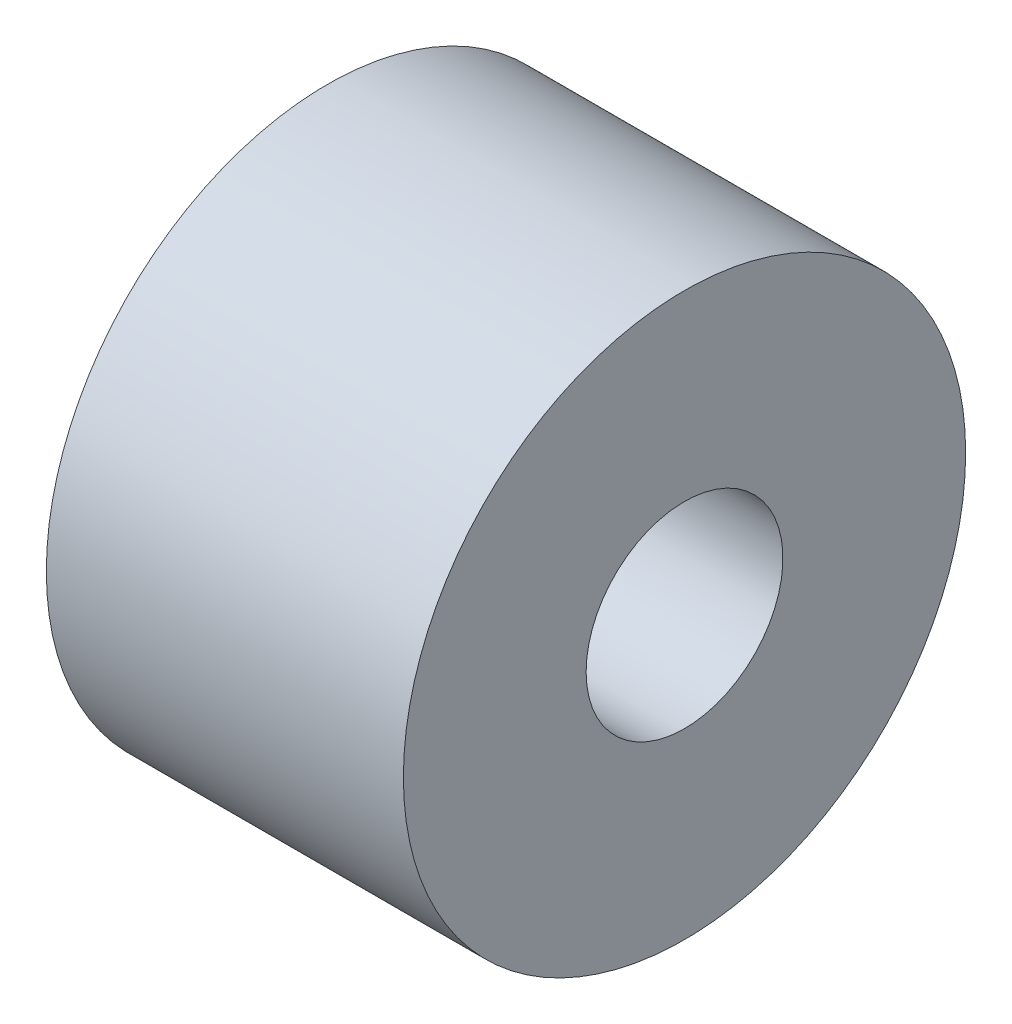
ISO-10303-21;
HEADER;
FILE_DESCRIPTION(('STEP AP214'),'2;1');
FILE_NAME('part.step','',(''),(''),'','','');
FILE_SCHEMA(('AUTOMOTIVE_DESIGN { 1 0 10303 214 1 1 1 1 }'));
ENDSEC;
DATA;
#1=APPLICATION_CONTEXT('core data for automotive mechanical design processes');
#2=APPLICATION_PROTOCOL_DEFINITION('international standard','automotive_design',2000,#1);
#3=PRODUCT_CONTEXT('',#1,'mechanical');
#4=PRODUCT('Part','Part','',(#3));
#5=PRODUCT_RELATED_PRODUCT_CATEGORY('part','',(#4));
#6=PRODUCT_DEFINITION_FORMATION('','',#4);
#7=PRODUCT_DEFINITION_CONTEXT('part definition',#1,'design');
#8=PRODUCT_DEFINITION('design','',#6,#7);
#9=PRODUCT_DEFINITION_SHAPE('','',#8);
#10=(LENGTH_UNIT() NAMED_UNIT(*) SI_UNIT(.MILLI.,.METRE.));
#11=(NAMED_UNIT(*) PLANE_ANGLE_UNIT() SI_UNIT($,.RADIAN.));
#12=(NAMED_UNIT(*) SI_UNIT($,.STERADIAN.) SOLID_ANGLE_UNIT());
#13=UNCERTAINTY_MEASURE_WITH_UNIT(LENGTH_MEASURE(1.E-05),#10,'distance_accuracy_value','');
#14=(GEOMETRIC_REPRESENTATION_CONTEXT(3) GLOBAL_UNCERTAINTY_ASSIGNED_CONTEXT((#13)) GLOBAL_UNIT_ASSIGNED_CONTEXT((#10,
#11,#12)) REPRESENTATION_CONTEXT('',''));
#15=CARTESIAN_POINT('',(0.,0.,0.));
#16=DIRECTION('',(0.,0.,1.));
#17=DIRECTION('',(1.,0.,0.));
#18=AXIS2_PLACEMENT_3D('',#15,#16,#17);
#19=CARTESIAN_POINT('',(12.7,0.,0.));
#20=DIRECTION('',(-1.,0.,0.));
#21=DIRECTION('',(0.,0.,1.));
#22=AXIS2_PLACEMENT_3D('',#19,#20,#21);
#23=CYLINDRICAL_SURFACE('',#22,10.);
#24=CARTESIAN_POINT('',(12.7,0.,0.));
#25=DIRECTION('',(1.,0.,0.));
#26=DIRECTION('',(0.,0.,-1.));
#27=AXIS2_PLACEMENT_3D('',#24,#25,#26);
#28=CIRCLE('',#27,10.);
#29=CARTESIAN_POINT('',(12.7,0.,-10.));
#30=VERTEX_POINT('',#29);
#31=EDGE_CURVE('E10',#30,#30,#28,.T.);
#32=ORIENTED_EDGE('',*,*,#31,.F.);
#33=EDGE_LOOP('',(#32));
#34=FACE_BOUND('',#33,.T.);
#35=CARTESIAN_POINT('',(0.,0.,0.));
#36=DIRECTION('',(1.,0.,0.));
#37=DIRECTION('',(0.,0.,-1.));
#38=AXIS2_PLACEMENT_3D('',#35,#36,#37);
#39=CIRCLE('',#38,10.);
#40=CARTESIAN_POINT('',(0.,0.,-10.));
#41=VERTEX_POINT('',#40);
#42=EDGE_CURVE('E42',#41,#41,#39,.T.);
#43=ORIENTED_EDGE('',*,*,#42,.T.);
#44=EDGE_LOOP('',(#43));
#45=FACE_BOUND('',#44,.T.);
#46=ADVANCED_FACE('F39',(#34,#45),#23,.T.);
#47=CARTESIAN_POINT('',(12.7,0.,0.));
#48=DIRECTION('',(1.,0.,0.));
#49=DIRECTION('',(0.,0.,-1.));
#50=AXIS2_PLACEMENT_3D('',#47,#48,#49);
#51=PLANE('',#50);
#52=CARTESIAN_POINT('',(12.7,0.,0.));
#53=DIRECTION('',(-1.,0.,0.));
#54=DIRECTION('',(0.,0.,1.));
#55=AXIS2_PLACEMENT_3D('',#52,#53,#54);
#56=CIRCLE('',#55,3.5);
#57=CARTESIAN_POINT('',(12.7,0.,3.5));
#58=VERTEX_POINT('',#57);
#59=EDGE_CURVE('E49',#58,#58,#56,.T.);
#60=ORIENTED_EDGE('',*,*,#59,.T.);
#61=EDGE_LOOP('',(#60));
#62=FACE_BOUND('',#61,.T.);
#63=ORIENTED_EDGE('',*,*,#31,.T.);
#64=EDGE_LOOP('',(#63));
#65=FACE_BOUND('',#64,.T.);
#66=ADVANCED_FACE('F57',(#62,#65),#51,.T.);
#67=CARTESIAN_POINT('',(0.,0.,0.));
#68=DIRECTION('',(1.,0.,0.));
#69=DIRECTION('',(0.,0.,-1.));
#70=AXIS2_PLACEMENT_3D('',#67,#68,#69);
#71=PLANE('',#70);
#72=CARTESIAN_POINT('',(0.,0.,0.));
#73=DIRECTION('',(-1.,0.,0.));
#74=DIRECTION('',(0.,0.,1.));
#75=AXIS2_PLACEMENT_3D('',#72,#73,#74);
#76=CIRCLE('',#75,3.5);
#77=CARTESIAN_POINT('',(0.,0.,3.5));
#78=VERTEX_POINT('',#77);
#79=EDGE_CURVE('E51',#78,#78,#76,.T.);
#80=ORIENTED_EDGE('',*,*,#79,.F.);
#81=EDGE_LOOP('',(#80));
#82=FACE_BOUND('',#81,.T.);
#83=ORIENTED_EDGE('',*,*,#42,.F.);
#84=EDGE_LOOP('',(#83));
#85=FACE_BOUND('',#84,.T.);
#86=ADVANCED_FACE('F62',(#82,#85),#71,.F.);
#87=CARTESIAN_POINT('',(12.7,0.,0.));
#88=DIRECTION('',(-1.,0.,0.));
#89=DIRECTION('',(0.,0.,1.));
#90=AXIS2_PLACEMENT_3D('',#87,#88,#89);
#91=CYLINDRICAL_SURFACE('',#90,3.5);
#92=ORIENTED_EDGE('',*,*,#59,.F.);
#93=EDGE_LOOP('',(#92));
#94=FACE_BOUND('',#93,.T.);
#95=ORIENTED_EDGE('',*,*,#79,.T.);
#96=EDGE_LOOP('',(#95));
#97=FACE_BOUND('',#96,.T.);
#98=ADVANCED_FACE('F59',(#94,#97),#91,.F.);
#99=CLOSED_SHELL('',(#46,#66,#86,#98));
#100=MANIFOLD_SOLID_BREP('B2',#99);
#101=ADVANCED_BREP_SHAPE_REPRESENTATION('',(#18,#100),#14);
#102=SHAPE_DEFINITION_REPRESENTATION(#9,#101);
ENDSEC;
END-ISO-10303-21;
